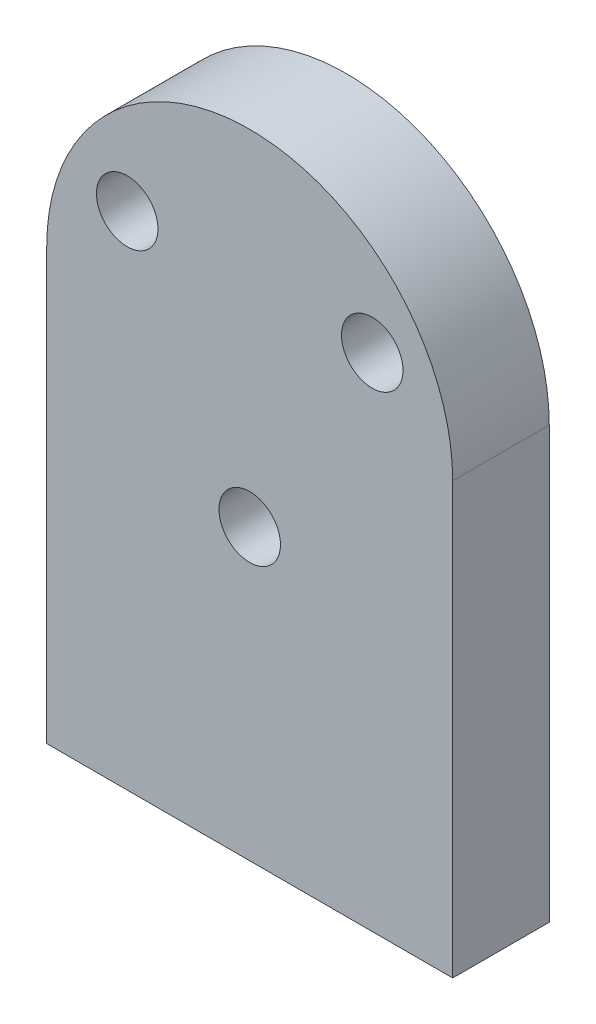
ISO-10303-21;
HEADER;
FILE_DESCRIPTION(('STEP AP214'),'2;1');
FILE_NAME('part.step','',(''),(''),'','','');
FILE_SCHEMA(('AUTOMOTIVE_DESIGN { 1 0 10303 214 1 1 1 1 }'));
ENDSEC;
DATA;
#1=APPLICATION_CONTEXT('core data for automotive mechanical design processes');
#2=APPLICATION_PROTOCOL_DEFINITION('international standard','automotive_design',2000,#1);
#3=PRODUCT_CONTEXT('',#1,'mechanical');
#4=PRODUCT('Part','Part','',(#3));
#5=PRODUCT_RELATED_PRODUCT_CATEGORY('part','',(#4));
#6=PRODUCT_DEFINITION_FORMATION('','',#4);
#7=PRODUCT_DEFINITION_CONTEXT('part definition',#1,'design');
#8=PRODUCT_DEFINITION('design','',#6,#7);
#9=PRODUCT_DEFINITION_SHAPE('','',#8);
#10=(LENGTH_UNIT() NAMED_UNIT(*) SI_UNIT(.MILLI.,.METRE.));
#11=(NAMED_UNIT(*) PLANE_ANGLE_UNIT() SI_UNIT($,.RADIAN.));
#12=(NAMED_UNIT(*) SI_UNIT($,.STERADIAN.) SOLID_ANGLE_UNIT());
#13=UNCERTAINTY_MEASURE_WITH_UNIT(LENGTH_MEASURE(1.E-05),#10,'distance_accuracy_value','');
#14=(GEOMETRIC_REPRESENTATION_CONTEXT(3) GLOBAL_UNCERTAINTY_ASSIGNED_CONTEXT((#13)) GLOBAL_UNIT_ASSIGNED_CONTEXT((#10,
#11,#12)) REPRESENTATION_CONTEXT('',''));
#15=CARTESIAN_POINT('',(0.,0.,0.));
#16=DIRECTION('',(0.,0.,1.));
#17=DIRECTION('',(1.,0.,0.));
#18=AXIS2_PLACEMENT_3D('',#15,#16,#17);
#19=CARTESIAN_POINT('',(0.,0.,1.57));
#20=DIRECTION('',(0.,0.,1.));
#21=DIRECTION('',(1.,0.,0.));
#22=AXIS2_PLACEMENT_3D('',#19,#20,#21);
#23=PLANE('',#22);
#24=CARTESIAN_POINT('',(-1.9918584287042,1.15000000000001,1.57));
#25=DIRECTION('',(0.,0.,1.));
#26=DIRECTION('',(1.,0.,0.));
#27=AXIS2_PLACEMENT_3D('',#24,#25,#26);
#28=CIRCLE('',#27,0.5);
#29=CARTESIAN_POINT('',(-1.4918584287042,1.15000000000001,1.57));
#30=VERTEX_POINT('',#29);
#31=EDGE_CURVE('E134',#30,#30,#28,.T.);
#32=ORIENTED_EDGE('',*,*,#31,.F.);
#33=EDGE_LOOP('',(#32));
#34=FACE_BOUND('',#33,.T.);
#35=CARTESIAN_POINT('',(0.,0.,1.57));
#36=DIRECTION('',(0.,0.,1.));
#37=DIRECTION('',(1.,0.,0.));
#38=AXIS2_PLACEMENT_3D('',#35,#36,#37);
#39=CIRCLE('',#38,3.3);
#40=CARTESIAN_POINT('',(3.3,0.,1.57));
#41=VERTEX_POINT('',#40);
#42=CARTESIAN_POINT('',(-3.3,0.,1.57));
#43=VERTEX_POINT('',#42);
#44=EDGE_CURVE('E92',#41,#43,#39,.T.);
#45=ORIENTED_EDGE('',*,*,#44,.T.);
#46=DIRECTION('',(0.,-1.,0.));
#47=VECTOR('',#46,1.);
#48=CARTESIAN_POINT('',(-3.3,-7.,1.57));
#49=LINE('',#48,#47);
#50=CARTESIAN_POINT('',(-3.3,-7.,1.57));
#51=VERTEX_POINT('',#50);
#52=EDGE_CURVE('E87',#43,#51,#49,.T.);
#53=ORIENTED_EDGE('',*,*,#52,.T.);
#54=DIRECTION('',(1.,0.,0.));
#55=VECTOR('',#54,1.);
#56=CARTESIAN_POINT('',(3.3,-7.,1.57));
#57=LINE('',#56,#55);
#58=CARTESIAN_POINT('',(3.3,-7.,1.57));
#59=VERTEX_POINT('',#58);
#60=EDGE_CURVE('E90',#51,#59,#57,.T.);
#61=ORIENTED_EDGE('',*,*,#60,.T.);
#62=DIRECTION('',(0.,1.,0.));
#63=VECTOR('',#62,1.);
#64=CARTESIAN_POINT('',(3.3,0.,1.57));
#65=LINE('',#64,#63);
#66=EDGE_CURVE('E57',#59,#41,#65,.T.);
#67=ORIENTED_EDGE('',*,*,#66,.T.);
#68=EDGE_LOOP('',(#45,#53,#61,#67));
#69=FACE_BOUND('',#68,.T.);
#70=CARTESIAN_POINT('',(0.,-2.3,1.57));
#71=DIRECTION('',(0.,0.,1.));
#72=DIRECTION('',(1.,0.,0.));
#73=AXIS2_PLACEMENT_3D('',#70,#71,#72);
#74=CIRCLE('',#73,0.5);
#75=CARTESIAN_POINT('',(0.5,-2.3,1.57));
#76=VERTEX_POINT('',#75);
#77=EDGE_CURVE('E112',#76,#76,#74,.T.);
#78=ORIENTED_EDGE('',*,*,#77,.F.);
#79=EDGE_LOOP('',(#78));
#80=FACE_BOUND('',#79,.T.);
#81=CARTESIAN_POINT('',(1.99185842870422,1.14999999999998,1.57));
#82=DIRECTION('',(0.,0.,1.));
#83=DIRECTION('',(1.,0.,0.));
#84=AXIS2_PLACEMENT_3D('',#81,#82,#83);
#85=CIRCLE('',#84,0.5);
#86=CARTESIAN_POINT('',(2.49185842870422,1.14999999999998,1.57));
#87=VERTEX_POINT('',#86);
#88=EDGE_CURVE('E142',#87,#87,#85,.T.);
#89=ORIENTED_EDGE('',*,*,#88,.F.);
#90=EDGE_LOOP('',(#89));
#91=FACE_BOUND('',#90,.T.);
#92=ADVANCED_FACE('F39',(#34,#69,#80,#91),#23,.T.);
#93=CARTESIAN_POINT('',(0.,0.,0.));
#94=DIRECTION('',(0.,0.,1.));
#95=DIRECTION('',(1.,0.,0.));
#96=AXIS2_PLACEMENT_3D('',#93,#94,#95);
#97=PLANE('',#96);
#98=CARTESIAN_POINT('',(0.,0.,0.));
#99=DIRECTION('',(0.,0.,1.));
#100=DIRECTION('',(1.,0.,0.));
#101=AXIS2_PLACEMENT_3D('',#98,#99,#100);
#102=CIRCLE('',#101,3.3);
#103=CARTESIAN_POINT('',(3.3,0.,0.));
#104=VERTEX_POINT('',#103);
#105=CARTESIAN_POINT('',(-3.3,0.,0.));
#106=VERTEX_POINT('',#105);
#107=EDGE_CURVE('E108',#104,#106,#102,.T.);
#108=ORIENTED_EDGE('',*,*,#107,.F.);
#109=DIRECTION('',(0.,1.,0.));
#110=VECTOR('',#109,1.);
#111=CARTESIAN_POINT('',(3.3,0.,0.));
#112=LINE('',#111,#110);
#113=CARTESIAN_POINT('',(3.3,-7.,0.));
#114=VERTEX_POINT('',#113);
#115=EDGE_CURVE('E80',#114,#104,#112,.T.);
#116=ORIENTED_EDGE('',*,*,#115,.F.);
#117=DIRECTION('',(1.,0.,0.));
#118=VECTOR('',#117,1.);
#119=CARTESIAN_POINT('',(3.3,-7.,0.));
#120=LINE('',#119,#118);
#121=CARTESIAN_POINT('',(-3.3,-7.,0.));
#122=VERTEX_POINT('',#121);
#123=EDGE_CURVE('E74',#122,#114,#120,.T.);
#124=ORIENTED_EDGE('',*,*,#123,.F.);
#125=DIRECTION('',(0.,-1.,0.));
#126=VECTOR('',#125,1.);
#127=CARTESIAN_POINT('',(-3.3,-7.,0.));
#128=LINE('',#127,#126);
#129=EDGE_CURVE('E97',#106,#122,#128,.T.);
#130=ORIENTED_EDGE('',*,*,#129,.F.);
#131=EDGE_LOOP('',(#108,#116,#124,#130));
#132=FACE_BOUND('',#131,.T.);
#133=CARTESIAN_POINT('',(0.,-2.3,0.));
#134=DIRECTION('',(0.,0.,1.));
#135=DIRECTION('',(1.,0.,0.));
#136=AXIS2_PLACEMENT_3D('',#133,#134,#135);
#137=CIRCLE('',#136,0.5);
#138=CARTESIAN_POINT('',(0.5,-2.3,0.));
#139=VERTEX_POINT('',#138);
#140=EDGE_CURVE('E130',#139,#139,#137,.T.);
#141=ORIENTED_EDGE('',*,*,#140,.T.);
#142=EDGE_LOOP('',(#141));
#143=FACE_BOUND('',#142,.T.);
#144=CARTESIAN_POINT('',(-1.9918584287042,1.15000000000001,0.));
#145=DIRECTION('',(0.,0.,1.));
#146=DIRECTION('',(1.,0.,0.));
#147=AXIS2_PLACEMENT_3D('',#144,#145,#146);
#148=CIRCLE('',#147,0.5);
#149=CARTESIAN_POINT('',(-1.4918584287042,1.15000000000001,0.));
#150=VERTEX_POINT('',#149);
#151=EDGE_CURVE('E138',#150,#150,#148,.T.);
#152=ORIENTED_EDGE('',*,*,#151,.T.);
#153=EDGE_LOOP('',(#152));
#154=FACE_BOUND('',#153,.T.);
#155=CARTESIAN_POINT('',(1.99185842870422,1.14999999999998,0.));
#156=DIRECTION('',(0.,0.,1.));
#157=DIRECTION('',(1.,0.,0.));
#158=AXIS2_PLACEMENT_3D('',#155,#156,#157);
#159=CIRCLE('',#158,0.5);
#160=CARTESIAN_POINT('',(2.49185842870422,1.14999999999998,0.));
#161=VERTEX_POINT('',#160);
#162=EDGE_CURVE('E146',#161,#161,#159,.T.);
#163=ORIENTED_EDGE('',*,*,#162,.T.);
#164=EDGE_LOOP('',(#163));
#165=FACE_BOUND('',#164,.T.);
#166=ADVANCED_FACE('F125',(#132,#143,#154,#165),#97,.F.);
#167=CARTESIAN_POINT('',(0.,0.,1.57));
#168=DIRECTION('',(0.,0.,-1.));
#169=DIRECTION('',(-1.,0.,0.));
#170=AXIS2_PLACEMENT_3D('',#167,#168,#169);
#171=CYLINDRICAL_SURFACE('',#170,3.3);
#172=ORIENTED_EDGE('',*,*,#107,.T.);
#173=DIRECTION('',(0.,0.,-1.));
#174=VECTOR('',#173,1.);
#175=CARTESIAN_POINT('',(-3.3,0.,1.57));
#176=LINE('',#175,#174);
#177=EDGE_CURVE('E11',#43,#106,#176,.T.);
#178=ORIENTED_EDGE('',*,*,#177,.F.);
#179=ORIENTED_EDGE('',*,*,#44,.F.);
#180=DIRECTION('',(0.,0.,-1.));
#181=VECTOR('',#180,1.);
#182=CARTESIAN_POINT('',(3.3,0.,1.57));
#183=LINE('',#182,#181);
#184=EDGE_CURVE('E104',#41,#104,#183,.T.);
#185=ORIENTED_EDGE('',*,*,#184,.T.);
#186=EDGE_LOOP('',(#172,#178,#179,#185));
#187=FACE_BOUND('',#186,.T.);
#188=ADVANCED_FACE('F41',(#187),#171,.T.);
#189=CARTESIAN_POINT('',(-3.3,-7.,1.57));
#190=DIRECTION('',(1.,0.,0.));
#191=DIRECTION('',(0.,0.,-1.));
#192=AXIS2_PLACEMENT_3D('',#189,#190,#191);
#193=PLANE('',#192);
#194=ORIENTED_EDGE('',*,*,#129,.T.);
#195=DIRECTION('',(0.,0.,-1.));
#196=VECTOR('',#195,1.);
#197=CARTESIAN_POINT('',(-3.3,-7.,1.57));
#198=LINE('',#197,#196);
#199=EDGE_CURVE('E49',#51,#122,#198,.T.);
#200=ORIENTED_EDGE('',*,*,#199,.F.);
#201=ORIENTED_EDGE('',*,*,#52,.F.);
#202=ORIENTED_EDGE('',*,*,#177,.T.);
#203=EDGE_LOOP('',(#194,#200,#201,#202));
#204=FACE_BOUND('',#203,.T.);
#205=ADVANCED_FACE('F96',(#204),#193,.F.);
#206=CARTESIAN_POINT('',(3.3,-7.,1.57));
#207=DIRECTION('',(0.,1.,0.));
#208=DIRECTION('',(0.,0.,1.));
#209=AXIS2_PLACEMENT_3D('',#206,#207,#208);
#210=PLANE('',#209);
#211=ORIENTED_EDGE('',*,*,#123,.T.);
#212=DIRECTION('',(0.,0.,-1.));
#213=VECTOR('',#212,1.);
#214=CARTESIAN_POINT('',(3.3,-7.,1.57));
#215=LINE('',#214,#213);
#216=EDGE_CURVE('E99',#59,#114,#215,.T.);
#217=ORIENTED_EDGE('',*,*,#216,.F.);
#218=ORIENTED_EDGE('',*,*,#60,.F.);
#219=ORIENTED_EDGE('',*,*,#199,.T.);
#220=EDGE_LOOP('',(#211,#217,#218,#219));
#221=FACE_BOUND('',#220,.T.);
#222=ADVANCED_FACE('F100',(#221),#210,.F.);
#223=CARTESIAN_POINT('',(3.3,0.,1.57));
#224=DIRECTION('',(-1.,0.,0.));
#225=DIRECTION('',(0.,0.,1.));
#226=AXIS2_PLACEMENT_3D('',#223,#224,#225);
#227=PLANE('',#226);
#228=ORIENTED_EDGE('',*,*,#115,.T.);
#229=ORIENTED_EDGE('',*,*,#184,.F.);
#230=ORIENTED_EDGE('',*,*,#66,.F.);
#231=ORIENTED_EDGE('',*,*,#216,.T.);
#232=EDGE_LOOP('',(#228,#229,#230,#231));
#233=FACE_BOUND('',#232,.T.);
#234=ADVANCED_FACE('F122',(#233),#227,.F.);
#235=CARTESIAN_POINT('',(0.,-2.3,1.57));
#236=DIRECTION('',(0.,0.,-1.));
#237=DIRECTION('',(-1.,0.,0.));
#238=AXIS2_PLACEMENT_3D('',#235,#236,#237);
#239=CYLINDRICAL_SURFACE('',#238,0.5);
#240=ORIENTED_EDGE('',*,*,#77,.T.);
#241=EDGE_LOOP('',(#240));
#242=FACE_BOUND('',#241,.T.);
#243=ORIENTED_EDGE('',*,*,#140,.F.);
#244=EDGE_LOOP('',(#243));
#245=FACE_BOUND('',#244,.T.);
#246=ADVANCED_FACE('F166',(#242,#245),#239,.F.);
#247=CARTESIAN_POINT('',(-1.9918584287042,1.15000000000001,1.57));
#248=DIRECTION('',(0.,0.,-1.));
#249=DIRECTION('',(-1.,0.,0.));
#250=AXIS2_PLACEMENT_3D('',#247,#248,#249);
#251=CYLINDRICAL_SURFACE('',#250,0.5);
#252=ORIENTED_EDGE('',*,*,#31,.T.);
#253=EDGE_LOOP('',(#252));
#254=FACE_BOUND('',#253,.T.);
#255=ORIENTED_EDGE('',*,*,#151,.F.);
#256=EDGE_LOOP('',(#255));
#257=FACE_BOUND('',#256,.T.);
#258=ADVANCED_FACE('F212',(#254,#257),#251,.F.);
#259=CARTESIAN_POINT('',(1.99185842870422,1.14999999999998,1.57));
#260=DIRECTION('',(0.,0.,-1.));
#261=DIRECTION('',(-1.,0.,0.));
#262=AXIS2_PLACEMENT_3D('',#259,#260,#261);
#263=CYLINDRICAL_SURFACE('',#262,0.5);
#264=ORIENTED_EDGE('',*,*,#88,.T.);
#265=EDGE_LOOP('',(#264));
#266=FACE_BOUND('',#265,.T.);
#267=ORIENTED_EDGE('',*,*,#162,.F.);
#268=EDGE_LOOP('',(#267));
#269=FACE_BOUND('',#268,.T.);
#270=ADVANCED_FACE('F154',(#266,#269),#263,.F.);
#271=CLOSED_SHELL('',(#92,#166,#188,#205,#222,#234,#246,#258,#270));
#272=MANIFOLD_SOLID_BREP('B2',#271);
#273=ADVANCED_BREP_SHAPE_REPRESENTATION('',(#18,#272),#14);
#274=SHAPE_DEFINITION_REPRESENTATION(#9,#273);
ENDSEC;
END-ISO-10303-21;
